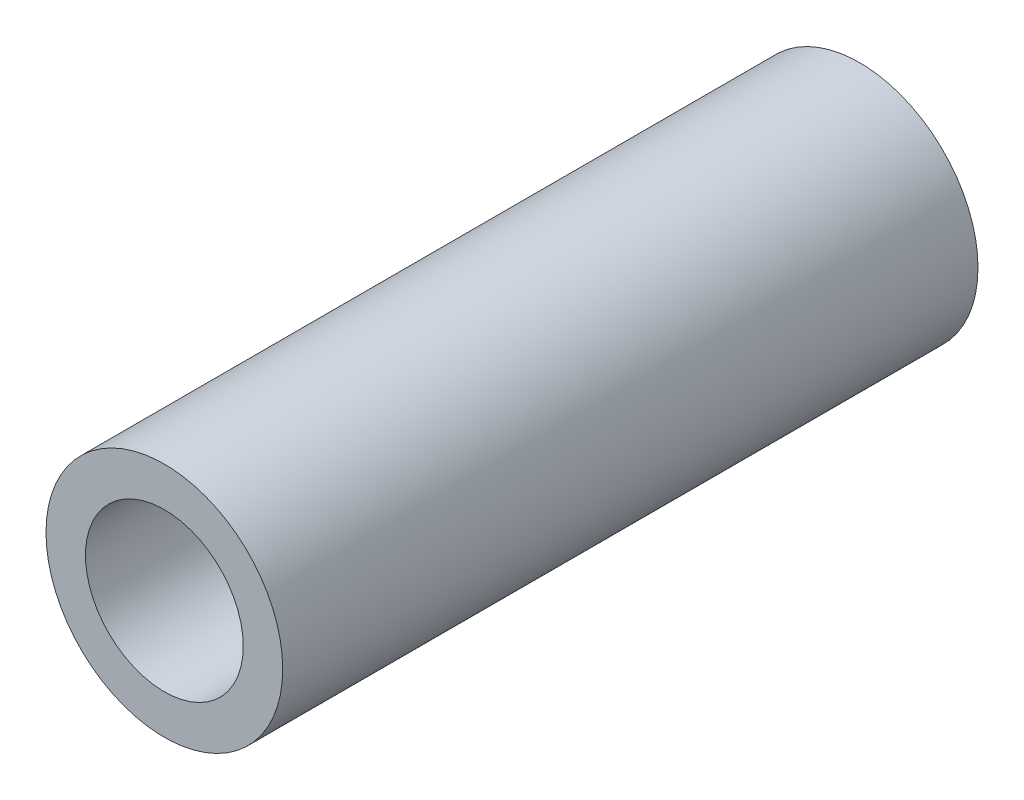
ISO-10303-21;
HEADER;
FILE_DESCRIPTION(('STEP AP214'),'2;1');
FILE_NAME('part.step','',(''),(''),'','','');
FILE_SCHEMA(('AUTOMOTIVE_DESIGN { 1 0 10303 214 1 1 1 1 }'));
ENDSEC;
DATA;
#1=APPLICATION_CONTEXT('core data for automotive mechanical design processes');
#2=APPLICATION_PROTOCOL_DEFINITION('international standard','automotive_design',2000,#1);
#3=PRODUCT_CONTEXT('',#1,'mechanical');
#4=PRODUCT('Part','Part','',(#3));
#5=PRODUCT_RELATED_PRODUCT_CATEGORY('part','',(#4));
#6=PRODUCT_DEFINITION_FORMATION('','',#4);
#7=PRODUCT_DEFINITION_CONTEXT('part definition',#1,'design');
#8=PRODUCT_DEFINITION('design','',#6,#7);
#9=PRODUCT_DEFINITION_SHAPE('','',#8);
#10=(LENGTH_UNIT() NAMED_UNIT(*) SI_UNIT(.MILLI.,.METRE.));
#11=(NAMED_UNIT(*) PLANE_ANGLE_UNIT() SI_UNIT($,.RADIAN.));
#12=(NAMED_UNIT(*) SI_UNIT($,.STERADIAN.) SOLID_ANGLE_UNIT());
#13=UNCERTAINTY_MEASURE_WITH_UNIT(LENGTH_MEASURE(1.E-05),#10,'distance_accuracy_value','');
#14=(GEOMETRIC_REPRESENTATION_CONTEXT(3) GLOBAL_UNCERTAINTY_ASSIGNED_CONTEXT((#13)) GLOBAL_UNIT_ASSIGNED_CONTEXT((#10,
#11,#12)) REPRESENTATION_CONTEXT('',''));
#15=CARTESIAN_POINT('',(0.,0.,0.));
#16=DIRECTION('',(0.,0.,1.));
#17=DIRECTION('',(1.,0.,0.));
#18=AXIS2_PLACEMENT_3D('',#15,#16,#17);
#19=CARTESIAN_POINT('',(3.5,-0.424264068711929,3.52490746997481));
#20=DIRECTION('',(0.,0.,1.));
#21=DIRECTION('',(1.,0.,0.));
#22=AXIS2_PLACEMENT_3D('',#19,#20,#21);
#23=PLANE('',#22);
#24=CARTESIAN_POINT('',(3.5,-0.424264068711929,3.52490746997481));
#25=DIRECTION('',(0.,0.,1.));
#26=DIRECTION('',(1.,0.,0.));
#27=AXIS2_PLACEMENT_3D('',#24,#25,#26);
#28=CIRCLE('',#27,0.6);
#29=CARTESIAN_POINT('',(4.1,-0.424264068711929,3.52490746997481));
#30=VERTEX_POINT('',#29);
#31=EDGE_CURVE('E11',#30,#30,#28,.T.);
#32=ORIENTED_EDGE('',*,*,#31,.T.);
#33=EDGE_LOOP('',(#32));
#34=FACE_BOUND('',#33,.T.);
#35=CARTESIAN_POINT('',(3.5,-0.424264068711929,3.52490746997481));
#36=DIRECTION('',(0.,0.,1.));
#37=DIRECTION('',(1.,0.,0.));
#38=AXIS2_PLACEMENT_3D('',#35,#36,#37);
#39=CIRCLE('',#38,0.4);
#40=CARTESIAN_POINT('',(3.9,-0.424264068711929,3.52490746997481));
#41=VERTEX_POINT('',#40);
#42=EDGE_CURVE('E47',#41,#41,#39,.T.);
#43=ORIENTED_EDGE('',*,*,#42,.F.);
#44=EDGE_LOOP('',(#43));
#45=FACE_BOUND('',#44,.T.);
#46=ADVANCED_FACE('F36',(#34,#45),#23,.T.);
#47=CARTESIAN_POINT('',(3.5,-0.424264068711929,0.));
#48=DIRECTION('',(0.,0.,1.));
#49=DIRECTION('',(1.,0.,0.));
#50=AXIS2_PLACEMENT_3D('',#47,#48,#49);
#51=PLANE('',#50);
#52=CARTESIAN_POINT('',(3.5,-0.424264068711929,0.));
#53=DIRECTION('',(0.,0.,1.));
#54=DIRECTION('',(1.,0.,0.));
#55=AXIS2_PLACEMENT_3D('',#52,#53,#54);
#56=CIRCLE('',#55,0.6);
#57=CARTESIAN_POINT('',(4.1,-0.424264068711929,0.));
#58=VERTEX_POINT('',#57);
#59=EDGE_CURVE('E40',#58,#58,#56,.T.);
#60=ORIENTED_EDGE('',*,*,#59,.F.);
#61=EDGE_LOOP('',(#60));
#62=FACE_BOUND('',#61,.T.);
#63=CARTESIAN_POINT('',(3.5,-0.424264068711929,0.));
#64=DIRECTION('',(0.,0.,1.));
#65=DIRECTION('',(1.,0.,0.));
#66=AXIS2_PLACEMENT_3D('',#63,#64,#65);
#67=CIRCLE('',#66,0.4);
#68=CARTESIAN_POINT('',(3.9,-0.424264068711929,0.));
#69=VERTEX_POINT('',#68);
#70=EDGE_CURVE('E49',#69,#69,#67,.T.);
#71=ORIENTED_EDGE('',*,*,#70,.T.);
#72=EDGE_LOOP('',(#71));
#73=FACE_BOUND('',#72,.T.);
#74=ADVANCED_FACE('F59',(#62,#73),#51,.F.);
#75=CARTESIAN_POINT('',(3.5,-0.424264068711929,3.52490746997481));
#76=DIRECTION('',(0.,0.,-1.));
#77=DIRECTION('',(-1.,0.,0.));
#78=AXIS2_PLACEMENT_3D('',#75,#76,#77);
#79=CYLINDRICAL_SURFACE('',#78,0.6);
#80=ORIENTED_EDGE('',*,*,#31,.F.);
#81=EDGE_LOOP('',(#80));
#82=FACE_BOUND('',#81,.T.);
#83=ORIENTED_EDGE('',*,*,#59,.T.);
#84=EDGE_LOOP('',(#83));
#85=FACE_BOUND('',#84,.T.);
#86=ADVANCED_FACE('F38',(#82,#85),#79,.T.);
#87=CARTESIAN_POINT('',(3.5,-0.424264068711929,3.52490746997481));
#88=DIRECTION('',(0.,0.,-1.));
#89=DIRECTION('',(-1.,0.,0.));
#90=AXIS2_PLACEMENT_3D('',#87,#88,#89);
#91=CYLINDRICAL_SURFACE('',#90,0.4);
#92=ORIENTED_EDGE('',*,*,#42,.T.);
#93=EDGE_LOOP('',(#92));
#94=FACE_BOUND('',#93,.T.);
#95=ORIENTED_EDGE('',*,*,#70,.F.);
#96=EDGE_LOOP('',(#95));
#97=FACE_BOUND('',#96,.T.);
#98=ADVANCED_FACE('F55',(#94,#97),#91,.F.);
#99=CLOSED_SHELL('',(#46,#74,#86,#98));
#100=MANIFOLD_SOLID_BREP('B2',#99);
#101=ADVANCED_BREP_SHAPE_REPRESENTATION('',(#18,#100),#14);
#102=SHAPE_DEFINITION_REPRESENTATION(#9,#101);
ENDSEC;
END-ISO-10303-21;
